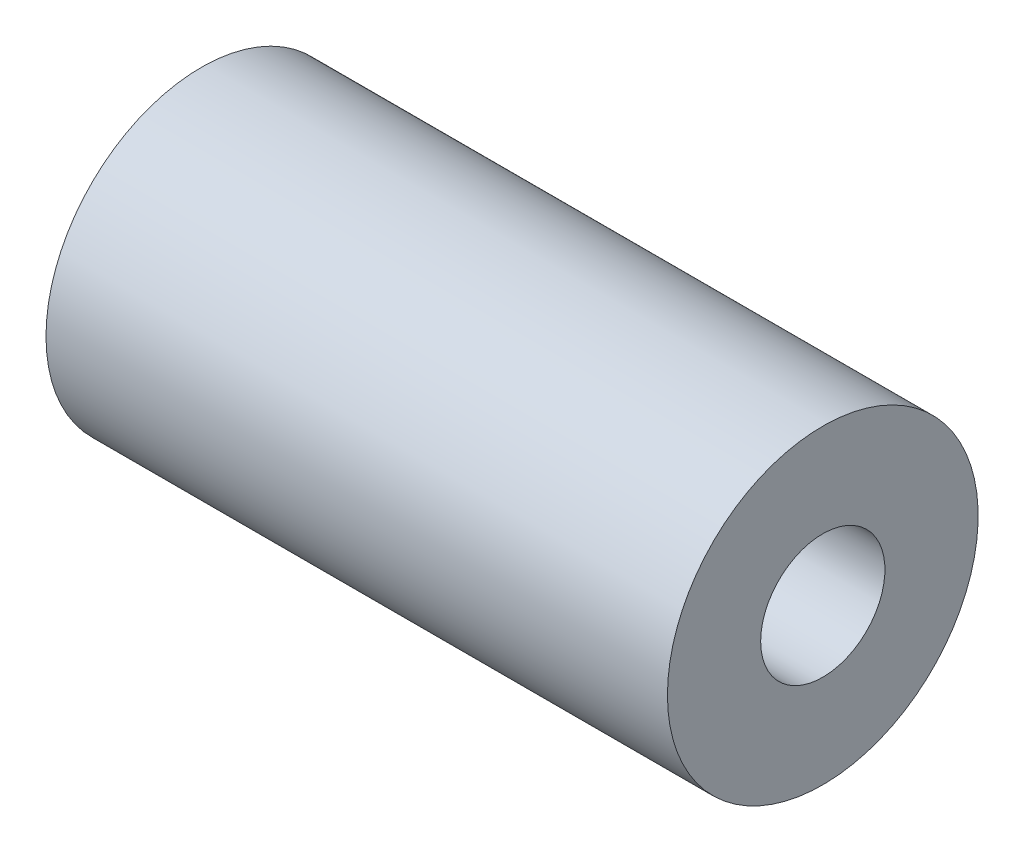
ISO-10303-21;
HEADER;
FILE_DESCRIPTION(('STEP AP214'),'2;1');
FILE_NAME('part.step','',(''),(''),'','','');
FILE_SCHEMA(('AUTOMOTIVE_DESIGN { 1 0 10303 214 1 1 1 1 }'));
ENDSEC;
DATA;
#1=APPLICATION_CONTEXT('core data for automotive mechanical design processes');
#2=APPLICATION_PROTOCOL_DEFINITION('international standard','automotive_design',2000,#1);
#3=PRODUCT_CONTEXT('',#1,'mechanical');
#4=PRODUCT('Part','Part','',(#3));
#5=PRODUCT_RELATED_PRODUCT_CATEGORY('part','',(#4));
#6=PRODUCT_DEFINITION_FORMATION('','',#4);
#7=PRODUCT_DEFINITION_CONTEXT('part definition',#1,'design');
#8=PRODUCT_DEFINITION('design','',#6,#7);
#9=PRODUCT_DEFINITION_SHAPE('','',#8);
#10=(LENGTH_UNIT() NAMED_UNIT(*) SI_UNIT(.MILLI.,.METRE.));
#11=(NAMED_UNIT(*) PLANE_ANGLE_UNIT() SI_UNIT($,.RADIAN.));
#12=(NAMED_UNIT(*) SI_UNIT($,.STERADIAN.) SOLID_ANGLE_UNIT());
#13=UNCERTAINTY_MEASURE_WITH_UNIT(LENGTH_MEASURE(1.E-05),#10,'distance_accuracy_value','');
#14=(GEOMETRIC_REPRESENTATION_CONTEXT(3) GLOBAL_UNCERTAINTY_ASSIGNED_CONTEXT((#13)) GLOBAL_UNIT_ASSIGNED_CONTEXT((#10,
#11,#12)) REPRESENTATION_CONTEXT('',''));
#15=CARTESIAN_POINT('',(0.,0.,0.));
#16=DIRECTION('',(0.,0.,1.));
#17=DIRECTION('',(1.,0.,0.));
#18=AXIS2_PLACEMENT_3D('',#15,#16,#17);
#19=CARTESIAN_POINT('',(0.,0.,0.));
#20=DIRECTION('',(-1.,0.,0.));
#21=DIRECTION('',(0.,0.,1.));
#22=AXIS2_PLACEMENT_3D('',#19,#20,#21);
#23=PLANE('',#22);
#24=CARTESIAN_POINT('',(0.,0.,0.));
#25=DIRECTION('',(-1.,0.,0.));
#26=DIRECTION('',(0.,0.,1.));
#27=AXIS2_PLACEMENT_3D('',#24,#25,#26);
#28=CIRCLE('',#27,7.5);
#29=CARTESIAN_POINT('',(0.,0.,7.5));
#30=VERTEX_POINT('',#29);
#31=EDGE_CURVE('E134',#30,#30,#28,.T.);
#32=ORIENTED_EDGE('',*,*,#31,.T.);
#33=EDGE_LOOP('',(#32));
#34=FACE_BOUND('',#33,.T.);
#35=CARTESIAN_POINT('',(0.,0.,0.));
#36=DIRECTION('',(-1.,0.,0.));
#37=DIRECTION('',(0.,0.,1.));
#38=AXIS2_PLACEMENT_3D('',#35,#36,#37);
#39=CIRCLE('',#38,2.5);
#40=CARTESIAN_POINT('',(0.,0.,2.5));
#41=VERTEX_POINT('',#40);
#42=EDGE_CURVE('E60',#41,#41,#39,.T.);
#43=ORIENTED_EDGE('',*,*,#42,.F.);
#44=EDGE_LOOP('',(#43));
#45=FACE_BOUND('',#44,.T.);
#46=ADVANCED_FACE('F43',(#34,#45),#23,.T.);
#47=CARTESIAN_POINT('',(-26.9453910052715,0.,0.));
#48=DIRECTION('',(-1.,0.,0.));
#49=DIRECTION('',(0.,0.,1.));
#50=AXIS2_PLACEMENT_3D('',#47,#48,#49);
#51=CYLINDRICAL_SURFACE('',#50,2.5);
#52=CARTESIAN_POINT('',(7.,-1.5,2.));
#53=CARTESIAN_POINT('',(6.92491898261144,-1.5000227575991,1.9999899563842));
#54=CARTESIAN_POINT('',(6.84972107390638,-1.50575588676017,1.99572243014959));
#55=CARTESIAN_POINT('',(6.70168547057038,-1.52759797098302,1.97904350434638));
#56=CARTESIAN_POINT('',(6.62885677818787,-1.54374252679463,1.96660415938923));
#57=CARTESIAN_POINT('',(6.46239458049145,-1.59078313764401,1.9288828901246));
#58=CARTESIAN_POINT('',(6.37035749290045,-1.62485949442394,1.90063587852784));
#59=CARTESIAN_POINT('',(6.19403185983871,-1.70094533012843,1.83286412912234));
#60=CARTESIAN_POINT('',(6.10976605033286,-1.74297705283045,1.79330760683741));
#61=CARTESIAN_POINT('',(5.91966034321949,-1.84624966659378,1.68777756612173));
#62=CARTESIAN_POINT('',(5.81703342587272,-1.90894188114929,1.61742363711761));
#63=CARTESIAN_POINT('',(5.62602316478778,-2.03287996747903,1.4586193506474));
#64=CARTESIAN_POINT('',(5.5376280578861,-2.0941269976447,1.37018407682201));
#65=CARTESIAN_POINT('',(5.39289508042252,-2.1979067439451,1.19476026278806));
#66=CARTESIAN_POINT('',(5.33367371731592,-2.24174680788007,1.11093376146689));
#67=CARTESIAN_POINT('',(5.2276340400337,-2.32165152523267,0.932444755507562));
#68=CARTESIAN_POINT('',(5.18079645179912,-2.35772824500368,0.837799422094949));
#69=CARTESIAN_POINT('',(5.10828703941934,-2.41415644696378,0.655317082222546));
#70=CARTESIAN_POINT('',(5.08041743542388,-2.43610736091393,0.568853585755692));
#71=CARTESIAN_POINT('',(5.036501304746,-2.47085912284979,0.391188052921989));
#72=CARTESIAN_POINT('',(5.02044831208995,-2.48366497483986,0.29998863731262));
#73=CARTESIAN_POINT('',(5.00114190670986,-2.49907968883617,0.115048335136525));
#74=CARTESIAN_POINT('',(4.99793280731136,-2.50165324772141,0.021299771372699));
#75=CARTESIAN_POINT('',(5.00466423487218,-2.49626936144757,-0.165416366428143));
#76=CARTESIAN_POINT('',(5.01460537036854,-2.48831142893578,-0.258383904122235));
#77=CARTESIAN_POINT('',(5.04606798631304,-2.4632836571348,-0.4356835684361));
#78=CARTESIAN_POINT('',(5.06692881695607,-2.44673404857181,-0.520210188917501));
#79=CARTESIAN_POINT('',(5.11869523425223,-2.40604493660584,-0.684171862172428));
#80=CARTESIAN_POINT('',(5.14960335549757,-2.38190351809567,-0.763605624129772));
#81=CARTESIAN_POINT('',(5.22360069858852,-2.32486221996811,-0.923527318234435));
#82=CARTESIAN_POINT('',(5.2675765160147,-2.29134265660255,-1.00337969293305));
#83=CARTESIAN_POINT('',(5.3645378595917,-2.21894043646479,-1.15470891362336));
#84=CARTESIAN_POINT('',(5.41752842936308,-2.18005477975511,-1.22618103296473));
#85=CARTESIAN_POINT('',(5.54306186879885,-2.09053510980241,-1.37426521356107));
#86=CARTESIAN_POINT('',(5.61738361420486,-2.03913144290366,-1.44890108738507));
#87=CARTESIAN_POINT('',(5.77625590365074,-1.9349237792571,-1.58538384993672));
#88=CARTESIAN_POINT('',(5.86081887867427,-1.88211814269102,-1.64721494436041));
#89=CARTESIAN_POINT('',(6.03122019581792,-1.78441317626436,-1.75228528490805));
#90=CARTESIAN_POINT('',(6.1161509405137,-1.73924224553799,-1.79674173995946));
#91=CARTESIAN_POINT('',(6.29436646633452,-1.65582105773209,-1.87389106987979));
#92=CARTESIAN_POINT('',(6.38763242033764,-1.61755576516689,-1.90660965872838));
#93=CARTESIAN_POINT('',(6.55279160402775,-1.56393805143324,-1.95062199735974));
#94=CARTESIAN_POINT('',(6.6226128308979,-1.54515601955456,-1.96540293714784));
#95=CARTESIAN_POINT('',(6.76518020595415,-1.51667304681101,-1.98746978122375));
#96=CARTESIAN_POINT('',(6.83791945391066,-1.50695186390373,-1.99477239579985));
#97=CARTESIAN_POINT('',(6.98486337792737,-1.49827790293909,-2.0012999442642));
#98=CARTESIAN_POINT('',(7.05907408505745,-1.49938753445573,-2.00047806264257));
#99=CARTESIAN_POINT('',(7.20604732503741,-1.51230456185753,-1.99072610261057));
#100=CARTESIAN_POINT('',(7.27880766638746,-1.52412705251965,-1.98178458332099));
#101=CARTESIAN_POINT('',(7.43906320266182,-1.56051508430773,-1.95331430449204));
#102=CARTESIAN_POINT('',(7.52559826813084,-1.58755721486228,-1.9316709289088));
#103=CARTESIAN_POINT('',(7.69229086608547,-1.65022809339808,-1.87841388450525));
#104=CARTESIAN_POINT('',(7.7724284809031,-1.6858823654909,-1.84677049067316));
#105=CARTESIAN_POINT('',(7.96152892934929,-1.77903249993889,-1.75807608919816));
#106=CARTESIAN_POINT('',(8.06689533432516,-1.83905564347523,-1.69602510944931));
#107=CARTESIAN_POINT('',(8.26438414924201,-1.96026853157683,-1.55438039564658));
#108=CARTESIAN_POINT('',(8.35649075968346,-2.02145957104429,-1.47476601547362));
#109=CARTESIAN_POINT('',(8.52746280734504,-2.13993299259157,-1.29702304107542));
#110=CARTESIAN_POINT('',(8.60612262911307,-2.1971478825966,-1.19864860522964));
#111=CARTESIAN_POINT('',(8.74526652744419,-2.30083046289374,-0.984970277741326));
#112=CARTESIAN_POINT('',(8.80580960567063,-2.3473329244064,-0.869723203455198));
#113=CARTESIAN_POINT('',(8.88849058746688,-2.41163161860482,-0.664531994140979));
#114=CARTESIAN_POINT('',(8.91671737697411,-2.43384921549885,-0.578408265123341));
#115=CARTESIAN_POINT('',(8.96143213496397,-2.46921550391513,-0.401365381235638));
#116=CARTESIAN_POINT('',(8.97792906454061,-2.48237111815073,-0.310449944179066));
#117=CARTESIAN_POINT('',(8.9981928241047,-2.49854699723994,-0.12596135805231));
#118=CARTESIAN_POINT('',(9.00191320505831,-2.50153028039159,-0.032379756145455));
#119=CARTESIAN_POINT('',(8.99623349073478,-2.4969871999336,0.154129494971549));
#120=CARTESIAN_POINT('',(8.98683247159171,-2.48946009629711,0.247057097671184));
#121=CARTESIAN_POINT('',(8.95639645290879,-2.46524008405095,0.424484983307841));
#122=CARTESIAN_POINT('',(8.93601066859716,-2.44905900306101,0.509170159101612));
#123=CARTESIAN_POINT('',(8.88514657868653,-2.4090520196301,0.673520542356742));
#124=CARTESIAN_POINT('',(8.85466565917398,-2.3852241372675,0.753184443303525));
#125=CARTESIAN_POINT('',(8.78162545560744,-2.32886203207213,0.913383591851868));
#126=CARTESIAN_POINT('',(8.73820615788901,-2.29572397002092,0.993310088153971));
#127=CARTESIAN_POINT('',(8.64235766290537,-2.22403396009593,1.14486396126305));
#128=CARTESIAN_POINT('',(8.58992368193151,-2.18547913977516,1.21648689776308));
#129=CARTESIAN_POINT('',(8.46570378699631,-2.0966685242987,1.36488223995397));
#130=CARTESIAN_POINT('',(8.39215358668459,-2.04563299169992,1.4397080379364));
#131=CARTESIAN_POINT('',(8.23488307447661,-1.94201312920059,1.5766935307999));
#132=CARTESIAN_POINT('',(8.15115017239467,-1.88942694411833,1.63883728583053));
#133=CARTESIAN_POINT('',(7.98104245547041,-1.79109125321811,1.7455126136634));
#134=CARTESIAN_POINT('',(7.89542747878393,-1.74513263017548,1.79106140064659));
#135=CARTESIAN_POINT('',(7.71560811174864,-1.66007449903139,1.87016304685231));
#136=CARTESIAN_POINT('',(7.62142022196227,-1.6209622208173,1.90373836359645));
#137=CARTESIAN_POINT('',(7.45386067324734,-1.56580101941138,1.94914139922438));
#138=CARTESIAN_POINT('',(7.38258045559281,-1.54635220628733,1.96446470848963));
#139=CARTESIAN_POINT('',(7.23697572902914,-1.51695472225641,1.98726282623961));
#140=CARTESIAN_POINT('',(7.16266394472206,-1.50696990066825,1.99476751139893));
#141=CARTESIAN_POINT('',(7.05867478565767,-1.50085460132402,1.99935742227831));
#142=CARTESIAN_POINT('',(7.02934632175654,-1.49999110491774,2.00000392566845));
#143=CARTESIAN_POINT('',(7.,-1.5,2.));
#144=B_SPLINE_CURVE_WITH_KNOTS('',3,(#52,#53,#54,#55,#56,#57,#58,#59,#60,#61,#62,#63,#64,#65,
#66,#67,#68,#69,#70,#71,#72,#73,#74,#75,#76,#77,#78,#79,#80,#81,#82,#83,#84,#85,#86,#87,#88,#89,
#90,#91,#92,#93,#94,#95,#96,#97,#98,#99,#100,#101,#102,#103,#104,#105,#106,#107,#108,#109,#110,
#111,#112,#113,#114,#115,#116,#117,#118,#119,#120,#121,#122,#123,#124,#125,#126,#127,#128,#129,
#130,#131,#132,#133,#134,#135,#136,#137,#138,#139,#140,#141,#142,#143),.UNSPECIFIED.,.T.,.F.,(4,
2,2,2,2,2,2,2,2,2,2,2,2,2,2,2,2,2,2,2,2,2,2,2,2,2,2,2,2,2,2,2,2,2,2,2,2,2,2,2,2,2,2,2,2,4),(0.,
0.225140818813291,0.451055593895017,0.75571438466088,1.06123795594964,1.47720804611674,
1.8928325353688,2.22639303179097,2.55943127851025,2.83862094435178,3.11765772560939,
3.39765639927928,3.67766803055209,3.94241917501297,4.20723715914625,4.49756510688428,
4.78805602626153,5.13841226546405,5.48919811771068,5.80619193384967,6.12248701337037,
6.34307726284838,6.56317352160417,6.78453876949456,7.00621641426759,7.28428560377195,
7.56318925297414,7.96975811975667,8.37680748728571,8.78961174948153,9.20105660259844,
9.47985927613151,9.75844872724253,10.0380499218877,10.3176708039936,10.5823344198312,
10.8470666181456,11.1364335884202,11.4259545900794,11.7747351905783,12.1239515037794,
12.4449574092071,12.7653580273015,12.9909138326702,13.2156045429056,13.3036035490356),.UNSPECIFIED.);
#145=CARTESIAN_POINT('',(7.,-1.5,2.));
#146=VERTEX_POINT('',#145);
#147=EDGE_CURVE('E90',#146,#146,#144,.T.);
#148=ORIENTED_EDGE('',*,*,#147,.T.);
#149=EDGE_LOOP('',(#148));
#150=FACE_BOUND('',#149,.T.);
#151=CARTESIAN_POINT('',(15.,0.,0.));
#152=DIRECTION('',(-1.,0.,0.));
#153=DIRECTION('',(0.,0.,1.));
#154=AXIS2_PLACEMENT_3D('',#151,#152,#153);
#155=CIRCLE('',#154,2.5);
#156=CARTESIAN_POINT('',(15.,0.,2.5));
#157=VERTEX_POINT('',#156);
#158=EDGE_CURVE('E65',#157,#157,#155,.T.);
#159=ORIENTED_EDGE('',*,*,#158,.F.);
#160=EDGE_LOOP('',(#159));
#161=FACE_BOUND('',#160,.T.);
#162=ORIENTED_EDGE('',*,*,#42,.T.);
#163=EDGE_LOOP('',(#162));
#164=FACE_BOUND('',#163,.T.);
#165=ADVANCED_FACE('F103',(#150,#161,#164),#51,.F.);
#166=CARTESIAN_POINT('',(15.,0.,0.));
#167=DIRECTION('',(-1.,0.,0.));
#168=DIRECTION('',(0.,0.,1.));
#169=AXIS2_PLACEMENT_3D('',#166,#167,#168);
#170=PLANE('',#169);
#171=CARTESIAN_POINT('',(15.,0.,0.));
#172=DIRECTION('',(-1.,0.,0.));
#173=DIRECTION('',(0.,0.,1.));
#174=AXIS2_PLACEMENT_3D('',#171,#172,#173);
#175=CIRCLE('',#174,3.);
#176=CARTESIAN_POINT('',(15.,0.,3.));
#177=VERTEX_POINT('',#176);
#178=EDGE_CURVE('E122',#177,#177,#175,.T.);
#179=ORIENTED_EDGE('',*,*,#178,.F.);
#180=EDGE_LOOP('',(#179));
#181=FACE_BOUND('',#180,.T.);
#182=ORIENTED_EDGE('',*,*,#158,.T.);
#183=EDGE_LOOP('',(#182));
#184=FACE_BOUND('',#183,.T.);
#185=ADVANCED_FACE('F100',(#181,#184),#170,.F.);
#186=CARTESIAN_POINT('',(-26.9453910052715,0.,0.));
#187=DIRECTION('',(-1.,0.,0.));
#188=DIRECTION('',(0.,0.,1.));
#189=AXIS2_PLACEMENT_3D('',#186,#187,#188);
#190=CYLINDRICAL_SURFACE('',#189,3.);
#191=CARTESIAN_POINT('',(23.,-2.23606797749979,2.));
#192=CARTESIAN_POINT('',(22.9023716891314,-2.23607753462817,1.99999453997731));
#193=CARTESIAN_POINT('',(22.8047092462912,-2.24258071047442,1.99278992503664));
#194=CARTESIAN_POINT('',(22.6128800883492,-2.26731972501617,1.96458268317731));
#195=CARTESIAN_POINT('',(22.5187199644704,-2.2855766081271,1.94355530587862));
#196=CARTESIAN_POINT('',(22.3372645581223,-2.3305658582557,1.88935861676632));
#197=CARTESIAN_POINT('',(22.2499123032623,-2.35721561794602,1.85630718014214));
#198=CARTESIAN_POINT('',(22.0821341676533,-2.41584094681825,1.77934008393538));
#199=CARTESIAN_POINT('',(22.0017097300235,-2.44781762158831,1.73542216812163));
#200=CARTESIAN_POINT('',(21.8363531123831,-2.51946072932026,1.63002410007714));
#201=CARTESIAN_POINT('',(21.7526678822828,-2.55954936090364,1.56687435451732));
#202=CARTESIAN_POINT('',(21.5959972911257,-2.63944827308083,1.4281921974068));
#203=CARTESIAN_POINT('',(21.5230224783415,-2.67925824297985,1.3526477317708));
#204=CARTESIAN_POINT('',(21.3793563412183,-2.76088818523747,1.17815690494295));
#205=CARTESIAN_POINT('',(21.3105174882243,-2.80216785846923,1.07740643965819));
#206=CARTESIAN_POINT('',(21.1913579045099,-2.87558484482764,0.862470964212231));
#207=CARTESIAN_POINT('',(21.1410164859688,-2.90773236231037,0.748301152321704));
#208=CARTESIAN_POINT('',(21.0664435989825,-2.95599907464725,0.523249073480004));
#209=CARTESIAN_POINT('',(21.0399166555044,-2.97351175615867,0.413434725181417));
#210=CARTESIAN_POINT('',(21.0058155107164,-2.99609745461921,0.189695448729862));
#211=CARTESIAN_POINT('',(20.9982174407746,-3.00118613762359,0.0757758812858253));
#212=CARTESIAN_POINT('',(21.0021724499491,-2.99855361722953,-0.134147050232329));
#213=CARTESIAN_POINT('',(21.0109890513171,-2.99266264910127,-0.230240638008752));
#214=CARTESIAN_POINT('',(21.0420910513589,-2.9720818279002,-0.419238633271014));
#215=CARTESIAN_POINT('',(21.0643774323035,-2.95739133313102,-0.512142807649723));
#216=CARTESIAN_POINT('',(21.1211956847946,-2.92052091703736,-0.692077937671168));
#217=CARTESIAN_POINT('',(21.1556788851986,-2.89837077982679,-0.77913062384596));
#218=CARTESIAN_POINT('',(21.2355536429528,-2.84821104476287,-0.946209150653554));
#219=CARTESIAN_POINT('',(21.2809471915015,-2.82020037745161,-1.0262337049694));
#220=CARTESIAN_POINT('',(21.3879787374599,-2.75618058450702,-1.18828429196344));
#221=CARTESIAN_POINT('',(21.4509675233528,-2.71960408792025,-1.26919148099708));
#222=CARTESIAN_POINT('',(21.5878986794803,-2.64400601826998,-1.41998807498305));
#223=CARTESIAN_POINT('',(21.6618579459338,-2.60498072815232,-1.48986013519457));
#224=CARTESIAN_POINT('',(21.8319632102133,-2.52150044944151,-1.62772235326165));
#225=CARTESIAN_POINT('',(21.9297710797145,-2.47714320008932,-1.69373593126354));
#226=CARTESIAN_POINT('',(22.1375098392207,-2.39475610831095,-1.80834874945482));
#227=CARTESIAN_POINT('',(22.2474199944139,-2.3567157153489,-1.85697718654898));
#228=CARTESIAN_POINT('',(22.4447190620731,-2.30262870306889,-1.92332724567775));
#229=CARTESIAN_POINT('',(22.5295933700569,-2.28340364577668,-1.94590791747533));
#230=CARTESIAN_POINT('',(22.7030394898168,-2.25409039789612,-1.97979555580014));
#231=CARTESIAN_POINT('',(22.7916046111726,-2.24398636782354,-1.99112206964395));
#232=CARTESIAN_POINT('',(22.9704429864415,-2.23447556987372,-2.00179400148877));
#233=CARTESIAN_POINT('',(23.0607219785201,-2.2351153386647,-2.00108729753098));
#234=CARTESIAN_POINT('',(23.239683833955,-2.24709880368953,-1.98761629716365));
#235=CARTESIAN_POINT('',(23.3283653441074,-2.25845117648851,-1.97484222690381));
#236=CARTESIAN_POINT('',(23.4973894175498,-2.28927977500746,-1.93899811187046));
#237=CARTESIAN_POINT('',(23.5779277090026,-2.30833187069749,-1.91646174529973));
#238=CARTESIAN_POINT('',(23.7341262360503,-2.3522995853365,-1.86223041628513));
#239=CARTESIAN_POINT('',(23.809784822963,-2.3772171729463,-1.83053237805351));
#240=CARTESIAN_POINT('',(23.9702020038475,-2.43611483596194,-1.75163346599563));
#241=CARTESIAN_POINT('',(24.0537568115427,-2.47091081434316,-1.70260028818246));
#242=CARTESIAN_POINT('',(24.2124168026173,-2.54262514806633,-1.59352731501438));
#243=CARTESIAN_POINT('',(24.2875115167424,-2.57954604947543,-1.53347411883827));
#244=CARTESIAN_POINT('',(24.4439623474675,-2.66075678321007,-1.38876657712435));
#245=CARTESIAN_POINT('',(24.5231028482483,-2.70489452138573,-1.30160386514207));
#246=CARTESIAN_POINT('',(24.6658166829403,-2.78775581841637,-1.1130994886622));
#247=CARTESIAN_POINT('',(24.7294037712567,-2.82648414789457,-1.01177047745701));
#248=CARTESIAN_POINT('',(24.8278917389176,-2.88790821242222,-0.817487474821801));
#249=CARTESIAN_POINT('',(24.8659565044404,-2.91225458111008,-0.726662364886325));
#250=CARTESIAN_POINT('',(24.9286071943204,-2.95278707867041,-0.53875707902052));
#251=CARTESIAN_POINT('',(24.9532045028598,-2.96898009871993,-0.441682263858774));
#252=CARTESIAN_POINT('',(24.9876969638388,-2.99178364026746,-0.243369392303447));
#253=CARTESIAN_POINT('',(24.9975266795067,-2.99835150856532,-0.142114836924322));
#254=CARTESIAN_POINT('',(25.0016478514171,-3.00109821029056,0.0608555465807284));
#255=CARTESIAN_POINT('',(24.9959407519562,-2.99727800938901,0.162571330953444));
#256=CARTESIAN_POINT('',(24.9703405109953,-2.98029555977324,0.355757532528103));
#257=CARTESIAN_POINT('',(24.9515090151382,-2.96783277209856,0.447435143070527));
#258=CARTESIAN_POINT('',(24.9017619905691,-2.93536106206933,0.626018422997059));
#259=CARTESIAN_POINT('',(24.8708445846527,-2.91535096747103,0.712923348686887));
#260=CARTESIAN_POINT('',(24.796061295116,-2.86791765486194,0.885147296608348));
#261=CARTESIAN_POINT('',(24.7515496925049,-2.84013248946338,0.970083589200262));
#262=CARTESIAN_POINT('',(24.651849355374,-2.77975408235472,1.13155266268318));
#263=CARTESIAN_POINT('',(24.596654232048,-2.74715796645263,1.20808037205002));
#264=CARTESIAN_POINT('',(24.4673710976637,-2.67392931472394,1.36329422201402));
#265=CARTESIAN_POINT('',(24.391676976326,-2.6328391387737,1.44042679526091));
#266=CARTESIAN_POINT('',(24.2288864584542,-2.55053357649486,1.58160022281595));
#267=CARTESIAN_POINT('',(24.1417816111659,-2.50931811970155,1.64563128323923));
#268=CARTESIAN_POINT('',(23.9641324092447,-2.43384213590298,1.75513253518411));
#269=CARTESIAN_POINT('',(23.8743581900497,-2.39929086741904,1.8016464689721));
#270=CARTESIAN_POINT('',(23.6867155510068,-2.33747501591023,1.88115802340272));
#271=CARTESIAN_POINT('',(23.5888633061378,-2.31019631295305,1.91418190281333));
#272=CARTESIAN_POINT('',(23.4092285315755,-2.2719105192954,1.95936262470908));
#273=CARTESIAN_POINT('',(23.3286917632097,-2.25863695410151,1.97452228373248));
#274=CARTESIAN_POINT('',(23.1654435994955,-2.24071519216009,1.99483915818926));
#275=CARTESIAN_POINT('',(23.0827340557394,-2.23605987841475,2.00000462703715));
#276=CARTESIAN_POINT('',(23.,-2.23606797749979,2.));
#277=B_SPLINE_CURVE_WITH_KNOTS('',3,(#191,#192,#193,#194,#195,#196,#197,#198,#199,#200,#201,
#202,#203,#204,#205,#206,#207,#208,#209,#210,#211,#212,#213,#214,#215,#216,#217,#218,#219,#220,
#221,#222,#223,#224,#225,#226,#227,#228,#229,#230,#231,#232,#233,#234,#235,#236,#237,#238,#239,
#240,#241,#242,#243,#244,#245,#246,#247,#248,#249,#250,#251,#252,#253,#254,#255,#256,#257,#258,
#259,#260,#261,#262,#263,#264,#265,#266,#267,#268,#269,#270,#271,#272,#273,#274,#275,#276),
.UNSPECIFIED.,.T.,.F.,(4,2,2,2,2,2,2,2,2,2,2,2,2,2,2,2,2,2,2,2,2,2,2,2,2,2,2,2,2,2,2,2,2,2,2,2,
2,2,2,2,2,2,4),(0.,0.292506930722154,0.585539042259288,0.875772651216276,1.16606657266549,
1.50154677068638,1.83735518436275,2.22167031006289,2.6055542938858,2.94637482063579,
3.28676536688298,3.57539534955742,3.86404638283746,4.1515583197319,4.43912276903,
4.76447525946635,5.09033414796638,5.46678703504944,5.84260469743947,6.11126090401323,
6.37944966235486,6.64880037638036,6.91836943570597,7.17476451706935,7.43124577644956,
7.73899230052351,8.04711556801508,8.42254684520961,8.79764490572579,9.10070580611697,
9.40351012888471,9.70765229266163,10.0117661844614,10.2937678224973,10.5758132789284,
10.874178629859,11.1727229593109,11.5182220628451,11.863978504186,12.1833412579672,
12.5020793664922,12.7501661630425,12.9980479966543),.UNSPECIFIED.);
#278=CARTESIAN_POINT('',(23.,-2.23606797749979,2.));
#279=VERTEX_POINT('',#278);
#280=EDGE_CURVE('E82',#279,#279,#277,.T.);
#281=ORIENTED_EDGE('',*,*,#280,.T.);
#282=EDGE_LOOP('',(#281));
#283=FACE_BOUND('',#282,.T.);
#284=CARTESIAN_POINT('',(30.,0.,0.));
#285=DIRECTION('',(-1.,0.,0.));
#286=DIRECTION('',(0.,0.,1.));
#287=AXIS2_PLACEMENT_3D('',#284,#285,#286);
#288=CIRCLE('',#287,3.);
#289=CARTESIAN_POINT('',(30.,0.,3.));
#290=VERTEX_POINT('',#289);
#291=EDGE_CURVE('E125',#290,#290,#288,.T.);
#292=ORIENTED_EDGE('',*,*,#291,.F.);
#293=EDGE_LOOP('',(#292));
#294=FACE_BOUND('',#293,.T.);
#295=ORIENTED_EDGE('',*,*,#178,.T.);
#296=EDGE_LOOP('',(#295));
#297=FACE_BOUND('',#296,.T.);
#298=ADVANCED_FACE('F95',(#283,#294,#297),#190,.F.);
#299=CARTESIAN_POINT('',(30.,0.,0.));
#300=DIRECTION('',(1.,0.,0.));
#301=DIRECTION('',(0.,0.,-1.));
#302=AXIS2_PLACEMENT_3D('',#299,#300,#301);
#303=PLANE('',#302);
#304=ORIENTED_EDGE('',*,*,#291,.T.);
#305=EDGE_LOOP('',(#304));
#306=FACE_BOUND('',#305,.T.);
#307=CARTESIAN_POINT('',(30.,0.,0.));
#308=DIRECTION('',(-1.,0.,0.));
#309=DIRECTION('',(0.,0.,1.));
#310=AXIS2_PLACEMENT_3D('',#307,#308,#309);
#311=CIRCLE('',#310,7.5);
#312=CARTESIAN_POINT('',(30.,0.,7.5));
#313=VERTEX_POINT('',#312);
#314=EDGE_CURVE('E131',#313,#313,#311,.T.);
#315=ORIENTED_EDGE('',*,*,#314,.F.);
#316=EDGE_LOOP('',(#315));
#317=FACE_BOUND('',#316,.T.);
#318=ADVANCED_FACE('F99',(#306,#317),#303,.T.);
#319=CARTESIAN_POINT('',(-26.9453910052715,0.,0.));
#320=DIRECTION('',(-1.,0.,0.));
#321=DIRECTION('',(0.,0.,1.));
#322=AXIS2_PLACEMENT_3D('',#319,#320,#321);
#323=CYLINDRICAL_SURFACE('',#322,7.5);
#324=CARTESIAN_POINT('',(5.,-7.5,0.));
#325=CARTESIAN_POINT('',(5.00000261693485,-7.49999833810161,-0.110254555832854));
#326=CARTESIAN_POINT('',(5.00914761418967,-7.49754486162151,-0.22053716022184));
#327=CARTESIAN_POINT('',(5.04542123073869,-7.48799573621659,-0.437925451354464));
#328=CARTESIAN_POINT('',(5.07255850442612,-7.48089785332586,-0.545029583319086));
#329=CARTESIAN_POINT('',(5.14387166686403,-7.4628433325279,-0.752891589045312));
#330=CARTESIAN_POINT('',(5.18802558766602,-7.45189167130375,-0.853657451015285));
#331=CARTESIAN_POINT('',(5.29203724266662,-7.42728699151678,-1.04635368639266));
#332=CARTESIAN_POINT('',(5.35189602335929,-7.4136337929518,-1.13828347044963));
#333=CARTESIAN_POINT('',(5.48708351641337,-7.38474614901995,-1.31282950374002));
#334=CARTESIAN_POINT('',(5.56270866800826,-7.36948467678681,-1.39521168986279));
#335=CARTESIAN_POINT('',(5.72664848306335,-7.33927409679591,-1.54628713660638));
#336=CARTESIAN_POINT('',(5.81496477761753,-7.32432502947243,-1.61497863495664));
#337=CARTESIAN_POINT('',(6.00364823482545,-7.29615537464372,-1.73786409243415));
#338=CARTESIAN_POINT('',(6.10419632826173,-7.28296888563239,-1.79178877736487));
#339=CARTESIAN_POINT('',(6.31334011109243,-7.26021477318187,-1.88187548076994));
#340=CARTESIAN_POINT('',(6.42193431233144,-7.25064648253265,-1.91804077451369));
#341=CARTESIAN_POINT('',(6.64149553782502,-7.23649115802399,-1.97076920226504));
#342=CARTESIAN_POINT('',(6.75235353993074,-7.2317964781149,-1.98775670244692));
#343=CARTESIAN_POINT('',(6.97543768330654,-7.2275983091637,-2.0029703470582));
#344=CARTESIAN_POINT('',(7.08766356502407,-7.22809385014446,-2.00119999705754));
#345=CARTESIAN_POINT('',(7.30698541537406,-7.2341237880203,-1.97928510002699));
#346=CARTESIAN_POINT('',(7.41413718203849,-7.23951735511531,-1.95965406064765));
#347=CARTESIAN_POINT('',(7.62356833445625,-7.25451013080688,-1.90339748722183));
#348=CARTESIAN_POINT('',(7.72584733007535,-7.26410967552612,-1.86677059492995));
#349=CARTESIAN_POINT('',(7.92396814380858,-7.28655661748386,-1.77714356965256));
#350=CARTESIAN_POINT('',(8.01972433928626,-7.29943942818703,-1.72396341137784));
#351=CARTESIAN_POINT('',(8.20113415885152,-7.32698229642445,-1.60286503823778));
#352=CARTESIAN_POINT('',(8.28678578915647,-7.34164270355186,-1.53494392224251));
#353=CARTESIAN_POINT('',(8.4484889974548,-7.37167510629864,-1.38366607263419));
#354=CARTESIAN_POINT('',(8.52413631831495,-7.38705471488831,-1.29987812728299));
#355=CARTESIAN_POINT('',(8.66038878035029,-7.41636381276316,-1.12061766820637));
#356=CARTESIAN_POINT('',(8.72099332870243,-7.43029324488555,-1.02514469420509));
#357=CARTESIAN_POINT('',(8.82561790282465,-7.45521820398293,-0.824598255497451));
#358=CARTESIAN_POINT('',(8.86956477044859,-7.4662007283356,-0.719484902551789));
#359=CARTESIAN_POINT('',(8.93904718881337,-7.48390044400999,-0.503002294390395));
#360=CARTESIAN_POINT('',(8.96458676272396,-7.49061856733749,-0.391634411928323));
#361=CARTESIAN_POINT('',(8.99589487691783,-7.49889158558384,-0.169254083145515));
#362=CARTESIAN_POINT('',(9.00221303985087,-7.50058997470959,-0.0583242376413803));
#363=CARTESIAN_POINT('',(8.99641683575306,-7.49904471691695,0.163010045901199));
#364=CARTESIAN_POINT('',(8.98430437389423,-7.49580158080353,0.273414537062114));
#365=CARTESIAN_POINT('',(8.94244155254002,-7.48483035496021,0.48860244990178));
#366=CARTESIAN_POINT('',(8.91299775380224,-7.47718026546329,0.593449852027782));
#367=CARTESIAN_POINT('',(8.83766405549205,-7.45826294894139,0.796706971176065));
#368=CARTESIAN_POINT('',(8.79177237374945,-7.44699532996161,0.895115989216028));
#369=CARTESIAN_POINT('',(8.68382611281946,-7.42175660559528,1.08483847466795));
#370=CARTESIAN_POINT('',(8.62147253320226,-7.40773686604957,1.17597518846118));
#371=CARTESIAN_POINT('',(8.48274836984201,-7.37861452365564,1.34668463539715));
#372=CARTESIAN_POINT('',(8.40637501739894,-7.3635117072752,1.42625507879918));
#373=CARTESIAN_POINT('',(8.23921442250544,-7.33339745866705,1.57388924478774));
#374=CARTESIAN_POINT('',(8.14808143860483,-7.31840061429312,1.64156519249816));
#375=CARTESIAN_POINT('',(7.95543530390038,-7.29066447182727,1.76067191185118));
#376=CARTESIAN_POINT('',(7.8539225863777,-7.27792507956316,1.81210336122161));
#377=CARTESIAN_POINT('',(7.6439046929239,-7.2562926837321,1.89687411586112));
#378=CARTESIAN_POINT('',(7.53544418818242,-7.24737748318009,1.93031812253958));
#379=CARTESIAN_POINT('',(7.31416068032525,-7.23439825126801,1.97841205118791));
#380=CARTESIAN_POINT('',(7.20133879965208,-7.23033298020014,1.99306677602478));
#381=CARTESIAN_POINT('',(6.9785052121162,-7.22761744573589,2.00288989653714));
#382=CARTESIAN_POINT('',(6.86852267974171,-7.22879397743239,1.99868155618109));
#383=CARTESIAN_POINT('',(6.65089648598997,-7.23602396081087,1.97234376000439));
#384=CARTESIAN_POINT('',(6.54325276449942,-7.24207728699439,1.95021476535025));
#385=CARTESIAN_POINT('',(6.33414424787015,-7.25827571073158,1.88902515699699));
#386=CARTESIAN_POINT('',(6.23263815726782,-7.26838885019644,1.8500966107558));
#387=CARTESIAN_POINT('',(6.03752116946586,-7.29156818136177,1.75651554562386));
#388=CARTESIAN_POINT('',(5.94391151369951,-7.30463483621364,1.70186056024617));
#389=CARTESIAN_POINT('',(5.76426964050338,-7.3327292144046,1.57648909268817));
#390=CARTESIAN_POINT('',(5.67854146502379,-7.3478033310169,1.50534729767909));
#391=CARTESIAN_POINT('',(5.52003754833267,-7.37795503783007,1.349830535111));
#392=CARTESIAN_POINT('',(5.44726496133116,-7.39303262798441,1.26545235435875));
#393=CARTESIAN_POINT('',(5.31520776235314,-7.42187812403968,1.08367998108868));
#394=CARTESIAN_POINT('',(5.25624498935067,-7.43561111314551,0.986045961751778));
#395=CARTESIAN_POINT('',(5.15566258407064,-7.45983810102897,0.781888640416888));
#396=CARTESIAN_POINT('',(5.1140318243364,-7.47033417683594,0.675371094696295));
#397=CARTESIAN_POINT('',(5.05472471458448,-7.48554752513468,0.474374704880989));
#398=CARTESIAN_POINT('',(5.0342506164075,-7.49092770592602,0.380762016565035));
#399=CARTESIAN_POINT('',(5.00688779383294,-7.49815449036456,0.191439795317076));
#400=CARTESIAN_POINT('',(4.99999772779998,-7.5000014429727,0.09573047040486));
#401=CARTESIAN_POINT('',(5.,-7.5,0.));
#402=B_SPLINE_CURVE_WITH_KNOTS('',3,(#324,#325,#326,#327,#328,#329,#330,#331,#332,#333,#334,
#335,#336,#337,#338,#339,#340,#341,#342,#343,#344,#345,#346,#347,#348,#349,#350,#351,#352,#353,
#354,#355,#356,#357,#358,#359,#360,#361,#362,#363,#364,#365,#366,#367,#368,#369,#370,#371,#372,
#373,#374,#375,#376,#377,#378,#379,#380,#381,#382,#383,#384,#385,#386,#387,#388,#389,#390,#391,
#392,#393,#394,#395,#396,#397,#398,#399,#400,#401),.UNSPECIFIED.,.T.,.F.,(4,2,2,2,2,2,2,2,2,2,2,
2,2,2,2,2,2,2,2,2,2,2,2,2,2,2,2,2,2,2,2,2,2,2,2,2,2,2,4),(0.,0.330412598949569,0.66098424376145,
0.991130552971932,1.32129886708675,1.65834897954967,1.99544244925149,2.33832582523229,
2.681145941297,3.01622158250468,3.3512346040432,3.67691002045997,4.0026114681294,
4.33198673346498,4.6614268811763,5.00161259812322,5.34181171937597,5.68348809603041,
6.02508977190139,6.35682717524547,6.68853028925351,7.01453535642116,7.34057575775614,
7.6730028600455,8.00549568258887,8.34736496382789,8.68921998024107,9.02906297699387,
9.36881908663983,9.69743342403611,10.0260393052059,10.352107654483,10.67822717123,
11.0139433957139,11.3497412433245,11.692722522809,12.0354832614518,12.3223981899334,
12.6092847796638),.UNSPECIFIED.);
#403=CARTESIAN_POINT('',(5.,-7.5,0.));
#404=VERTEX_POINT('',#403);
#405=EDGE_CURVE('E10',#404,#404,#402,.T.);
#406=ORIENTED_EDGE('',*,*,#405,.F.);
#407=EDGE_LOOP('',(#406));
#408=FACE_BOUND('',#407,.T.);
#409=CARTESIAN_POINT('',(21.,-7.5,0.));
#410=CARTESIAN_POINT('',(21.0000026169349,-7.49999833810161,-0.110254555832854));
#411=CARTESIAN_POINT('',(21.0091476141897,-7.49754486162151,-0.22053716022184));
#412=CARTESIAN_POINT('',(21.0454212307387,-7.48799573621659,-0.437925451354463));
#413=CARTESIAN_POINT('',(21.0725585044261,-7.48089785332586,-0.545029583319085));
#414=CARTESIAN_POINT('',(21.143871666864,-7.4628433325279,-0.75289158904531));
#415=CARTESIAN_POINT('',(21.188025587666,-7.45189167130375,-0.853657451015281));
#416=CARTESIAN_POINT('',(21.2920372426666,-7.42728699151678,-1.04635368639266));
#417=CARTESIAN_POINT('',(21.3518960233593,-7.4136337929518,-1.13828347044962));
#418=CARTESIAN_POINT('',(21.4870835164134,-7.38474614901995,-1.31282950374001));
#419=CARTESIAN_POINT('',(21.5627086680083,-7.36948467678681,-1.39521168986278));
#420=CARTESIAN_POINT('',(21.7266484830634,-7.33927409679591,-1.54628713660638));
#421=CARTESIAN_POINT('',(21.8149647776175,-7.32432502947243,-1.61497863495664));
#422=CARTESIAN_POINT('',(22.0036482348254,-7.29615537464372,-1.73786409243415));
#423=CARTESIAN_POINT('',(22.1041963282617,-7.28296888563239,-1.79178877736487));
#424=CARTESIAN_POINT('',(22.3133401110924,-7.26021477318187,-1.88187548076994));
#425=CARTESIAN_POINT('',(22.4219343123314,-7.25064648253265,-1.91804077451369));
#426=CARTESIAN_POINT('',(22.641495537825,-7.23649115802399,-1.97076920226504));
#427=CARTESIAN_POINT('',(22.7523535399307,-7.2317964781149,-1.98775670244692));
#428=CARTESIAN_POINT('',(22.9754376833065,-7.22759830916371,-2.0029703470582));
#429=CARTESIAN_POINT('',(23.0876635650241,-7.22809385014446,-2.00119999705753));
#430=CARTESIAN_POINT('',(23.3069854153741,-7.23412378802031,-1.97928510002699));
#431=CARTESIAN_POINT('',(23.4141371820385,-7.23951735511531,-1.95965406064765));
#432=CARTESIAN_POINT('',(23.6235683344562,-7.25451013080688,-1.90339748722183));
#433=CARTESIAN_POINT('',(23.7258473300753,-7.26410967552612,-1.86677059492995));
#434=CARTESIAN_POINT('',(23.9239681438086,-7.28655661748386,-1.77714356965256));
#435=CARTESIAN_POINT('',(24.0197243392863,-7.29943942818703,-1.72396341137784));
#436=CARTESIAN_POINT('',(24.2011341588515,-7.32698229642445,-1.60286503823778));
#437=CARTESIAN_POINT('',(24.2867857891565,-7.34164270355186,-1.53494392224251));
#438=CARTESIAN_POINT('',(24.4484889974548,-7.37167510629864,-1.38366607263419));
#439=CARTESIAN_POINT('',(24.5241363183149,-7.38705471488831,-1.29987812728299));
#440=CARTESIAN_POINT('',(24.6603887803503,-7.41636381276316,-1.12061766820637));
#441=CARTESIAN_POINT('',(24.7209933287024,-7.43029324488555,-1.02514469420509));
#442=CARTESIAN_POINT('',(24.8256179028246,-7.45521820398293,-0.824598255497452));
#443=CARTESIAN_POINT('',(24.8695647704486,-7.4662007283356,-0.71948490255179));
#444=CARTESIAN_POINT('',(24.9390471888134,-7.48390044400999,-0.503002294390397));
#445=CARTESIAN_POINT('',(24.964586762724,-7.49061856733749,-0.391634411928325));
#446=CARTESIAN_POINT('',(24.9958948769178,-7.49889158558384,-0.169254083145517));
#447=CARTESIAN_POINT('',(25.0022130398509,-7.50058997470959,-0.0583242376413818));
#448=CARTESIAN_POINT('',(24.9964168357531,-7.49904471691695,0.163010045901197));
#449=CARTESIAN_POINT('',(24.9843043738942,-7.49580158080353,0.273414537062112));
#450=CARTESIAN_POINT('',(24.94244155254,-7.48483035496021,0.488602449901778));
#451=CARTESIAN_POINT('',(24.9129977538022,-7.47718026546329,0.593449852027781));
#452=CARTESIAN_POINT('',(24.8376640554921,-7.45826294894139,0.796706971176064));
#453=CARTESIAN_POINT('',(24.7917723737495,-7.44699532996161,0.895115989216026));
#454=CARTESIAN_POINT('',(24.6838261128195,-7.42175660559528,1.08483847466795));
#455=CARTESIAN_POINT('',(24.6214725332023,-7.40773686604957,1.17597518846118));
#456=CARTESIAN_POINT('',(24.482748369842,-7.37861452365564,1.34668463539714));
#457=CARTESIAN_POINT('',(24.4063750173989,-7.3635117072752,1.42625507879918));
#458=CARTESIAN_POINT('',(24.2392144225054,-7.33339745866705,1.57388924478774));
#459=CARTESIAN_POINT('',(24.1480814386048,-7.31840061429312,1.64156519249816));
#460=CARTESIAN_POINT('',(23.9554353039004,-7.29066447182727,1.76067191185118));
#461=CARTESIAN_POINT('',(23.8539225863777,-7.27792507956316,1.81210336122161));
#462=CARTESIAN_POINT('',(23.6439046929239,-7.2562926837321,1.89687411586112));
#463=CARTESIAN_POINT('',(23.5354441881824,-7.24737748318009,1.93031812253957));
#464=CARTESIAN_POINT('',(23.3141606803252,-7.23439825126801,1.97841205118791));
#465=CARTESIAN_POINT('',(23.2013387996521,-7.23033298020014,1.99306677602478));
#466=CARTESIAN_POINT('',(22.9785052121162,-7.22761744573589,2.00288989653714));
#467=CARTESIAN_POINT('',(22.8685226797417,-7.22879397743239,1.99868155618109));
#468=CARTESIAN_POINT('',(22.65089648599,-7.23602396081087,1.97234376000439));
#469=CARTESIAN_POINT('',(22.5432527644994,-7.24207728699439,1.95021476535025));
#470=CARTESIAN_POINT('',(22.3341442478702,-7.25827571073158,1.88902515699699));
#471=CARTESIAN_POINT('',(22.2326381572678,-7.26838885019644,1.8500966107558));
#472=CARTESIAN_POINT('',(22.0375211694659,-7.29156818136177,1.75651554562386));
#473=CARTESIAN_POINT('',(21.9439115136995,-7.30463483621364,1.70186056024616));
#474=CARTESIAN_POINT('',(21.7642696405034,-7.3327292144046,1.57648909268817));
#475=CARTESIAN_POINT('',(21.6785414650238,-7.3478033310169,1.50534729767909));
#476=CARTESIAN_POINT('',(21.5200375483327,-7.37795503783007,1.349830535111));
#477=CARTESIAN_POINT('',(21.4472649613312,-7.39303262798441,1.26545235435875));
#478=CARTESIAN_POINT('',(21.3152077623531,-7.42187812403968,1.08367998108869));
#479=CARTESIAN_POINT('',(21.2562449893507,-7.43561111314551,0.98604596175178));
#480=CARTESIAN_POINT('',(21.1556625840706,-7.45983810102897,0.78188864041689));
#481=CARTESIAN_POINT('',(21.1140318243364,-7.47033417683594,0.675371094696297));
#482=CARTESIAN_POINT('',(21.0547247145845,-7.48554752513468,0.474374704880991));
#483=CARTESIAN_POINT('',(21.0342506164075,-7.49092770592602,0.380762016565036));
#484=CARTESIAN_POINT('',(21.0068877938329,-7.49815449036456,0.191439795317076));
#485=CARTESIAN_POINT('',(20.9999977278,-7.5000014429727,0.0957304704048602));
#486=CARTESIAN_POINT('',(21.,-7.5,0.));
#487=B_SPLINE_CURVE_WITH_KNOTS('',3,(#409,#410,#411,#412,#413,#414,#415,#416,#417,#418,#419,
#420,#421,#422,#423,#424,#425,#426,#427,#428,#429,#430,#431,#432,#433,#434,#435,#436,#437,#438,
#439,#440,#441,#442,#443,#444,#445,#446,#447,#448,#449,#450,#451,#452,#453,#454,#455,#456,#457,
#458,#459,#460,#461,#462,#463,#464,#465,#466,#467,#468,#469,#470,#471,#472,#473,#474,#475,#476,
#477,#478,#479,#480,#481,#482,#483,#484,#485,#486),.UNSPECIFIED.,.T.,.F.,(4,2,2,2,2,2,2,2,2,2,2,
2,2,2,2,2,2,2,2,2,2,2,2,2,2,2,2,2,2,2,2,2,2,2,2,2,2,2,4),(0.,0.330412598949568,
0.660984243761449,0.991130552971926,1.32129886708675,1.65834897954967,1.99544244925149,
2.33832582523229,2.68114594129699,3.01622158250467,3.3512346040432,3.67691002045997,
4.00261146812939,4.33198673346498,4.66142688117629,5.00161259812321,5.34181171937597,
5.68348809603041,6.02508977190138,6.35682717524546,6.6885302892535,7.01453535642115,
7.34057575775614,7.67300286004549,8.00549568258886,8.34736496382788,8.68921998024106,
9.02906297699386,9.36881908663982,9.69743342403611,10.0260393052059,10.352107654483,
10.67822717123,11.0139433957139,11.3497412433245,11.692722522809,12.0354832614518,
12.3223981899334,12.6092847796638),.UNSPECIFIED.);
#488=CARTESIAN_POINT('',(21.,-7.5,0.));
#489=VERTEX_POINT('',#488);
#490=EDGE_CURVE('E55',#489,#489,#487,.T.);
#491=ORIENTED_EDGE('',*,*,#490,.F.);
#492=EDGE_LOOP('',(#491));
#493=FACE_BOUND('',#492,.T.);
#494=ORIENTED_EDGE('',*,*,#314,.T.);
#495=EDGE_LOOP('',(#494));
#496=FACE_BOUND('',#495,.T.);
#497=ORIENTED_EDGE('',*,*,#31,.F.);
#498=EDGE_LOOP('',(#497));
#499=FACE_BOUND('',#498,.T.);
#500=ADVANCED_FACE('F72',(#408,#493,#496,#499),#323,.T.);
#501=CARTESIAN_POINT('',(23.,-7.5,0.));
#502=DIRECTION('',(0.,1.,0.));
#503=DIRECTION('',(0.,0.,1.));
#504=AXIS2_PLACEMENT_3D('',#501,#502,#503);
#505=CYLINDRICAL_SURFACE('',#504,2.);
#506=ORIENTED_EDGE('',*,*,#490,.T.);
#507=EDGE_LOOP('',(#506));
#508=FACE_BOUND('',#507,.T.);
#509=ORIENTED_EDGE('',*,*,#280,.F.);
#510=EDGE_LOOP('',(#509));
#511=FACE_BOUND('',#510,.T.);
#512=ADVANCED_FACE('F75',(#508,#511),#505,.F.);
#513=CARTESIAN_POINT('',(7.,-7.5,0.));
#514=DIRECTION('',(0.,1.,0.));
#515=DIRECTION('',(0.,0.,1.));
#516=AXIS2_PLACEMENT_3D('',#513,#514,#515);
#517=CYLINDRICAL_SURFACE('',#516,2.);
#518=ORIENTED_EDGE('',*,*,#405,.T.);
#519=EDGE_LOOP('',(#518));
#520=FACE_BOUND('',#519,.T.);
#521=ORIENTED_EDGE('',*,*,#147,.F.);
#522=EDGE_LOOP('',(#521));
#523=FACE_BOUND('',#522,.T.);
#524=ADVANCED_FACE('F78',(#520,#523),#517,.F.);
#525=CLOSED_SHELL('',(#46,#165,#185,#298,#318,#500,#512,#524));
#526=MANIFOLD_SOLID_BREP('B2',#525);
#527=ADVANCED_BREP_SHAPE_REPRESENTATION('',(#18,#526),#14);
#528=SHAPE_DEFINITION_REPRESENTATION(#9,#527);
ENDSEC;
END-ISO-10303-21;
